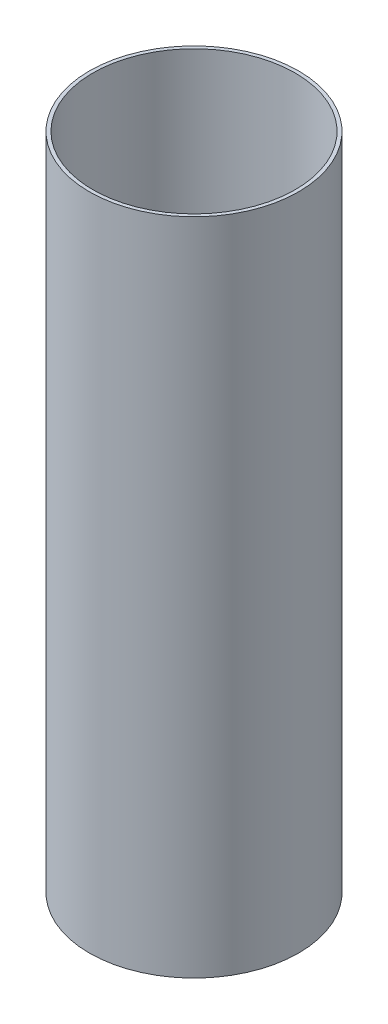
ISO-10303-21;
HEADER;
FILE_DESCRIPTION(('STEP AP214'),'2;1');
FILE_NAME('part.step','',(''),(''),'','','');
FILE_SCHEMA(('AUTOMOTIVE_DESIGN { 1 0 10303 214 1 1 1 1 }'));
ENDSEC;
DATA;
#1=APPLICATION_CONTEXT('core data for automotive mechanical design processes');
#2=APPLICATION_PROTOCOL_DEFINITION('international standard','automotive_design',2000,#1);
#3=PRODUCT_CONTEXT('',#1,'mechanical');
#4=PRODUCT('Part','Part','',(#3));
#5=PRODUCT_RELATED_PRODUCT_CATEGORY('part','',(#4));
#6=PRODUCT_DEFINITION_FORMATION('','',#4);
#7=PRODUCT_DEFINITION_CONTEXT('part definition',#1,'design');
#8=PRODUCT_DEFINITION('design','',#6,#7);
#9=PRODUCT_DEFINITION_SHAPE('','',#8);
#10=(LENGTH_UNIT() NAMED_UNIT(*) SI_UNIT(.MILLI.,.METRE.));
#11=(NAMED_UNIT(*) PLANE_ANGLE_UNIT() SI_UNIT($,.RADIAN.));
#12=(NAMED_UNIT(*) SI_UNIT($,.STERADIAN.) SOLID_ANGLE_UNIT());
#13=UNCERTAINTY_MEASURE_WITH_UNIT(LENGTH_MEASURE(1.E-05),#10,'distance_accuracy_value','');
#14=(GEOMETRIC_REPRESENTATION_CONTEXT(3) GLOBAL_UNCERTAINTY_ASSIGNED_CONTEXT((#13)) GLOBAL_UNIT_ASSIGNED_CONTEXT((#10,
#11,#12)) REPRESENTATION_CONTEXT('',''));
#15=CARTESIAN_POINT('',(0.,0.,0.));
#16=DIRECTION('',(0.,0.,1.));
#17=DIRECTION('',(1.,0.,0.));
#18=AXIS2_PLACEMENT_3D('',#15,#16,#17);
#19=CARTESIAN_POINT('',(92.075,600.,0.));
#20=DIRECTION('',(0.,1.,0.));
#21=DIRECTION('',(0.,0.,1.));
#22=AXIS2_PLACEMENT_3D('',#19,#20,#21);
#23=PLANE('',#22);
#24=CARTESIAN_POINT('',(0.,600.,0.));
#25=DIRECTION('',(0.,-1.,0.));
#26=DIRECTION('',(0.,0.,-1.));
#27=AXIS2_PLACEMENT_3D('',#24,#25,#26);
#28=CIRCLE('',#27,92.075);
#29=CARTESIAN_POINT('',(0.,600.,-92.075));
#30=VERTEX_POINT('',#29);
#31=EDGE_CURVE('E47',#30,#30,#28,.T.);
#32=ORIENTED_EDGE('',*,*,#31,.T.);
#33=EDGE_LOOP('',(#32));
#34=FACE_BOUND('',#33,.T.);
#35=CARTESIAN_POINT('',(0.,600.,0.));
#36=DIRECTION('',(0.,-1.,0.));
#37=DIRECTION('',(0.,0.,-1.));
#38=AXIS2_PLACEMENT_3D('',#35,#36,#37);
#39=CIRCLE('',#38,95.25);
#40=CARTESIAN_POINT('',(0.,600.,-95.25));
#41=VERTEX_POINT('',#40);
#42=EDGE_CURVE('E10',#41,#41,#39,.T.);
#43=ORIENTED_EDGE('',*,*,#42,.F.);
#44=EDGE_LOOP('',(#43));
#45=FACE_BOUND('',#44,.T.);
#46=ADVANCED_FACE('F33',(#34,#45),#23,.T.);
#47=CARTESIAN_POINT('',(0.,0.,0.));
#48=DIRECTION('',(0.,-1.,0.));
#49=DIRECTION('',(0.,0.,-1.));
#50=AXIS2_PLACEMENT_3D('',#47,#48,#49);
#51=CYLINDRICAL_SURFACE('',#50,95.2500000000001);
#52=ORIENTED_EDGE('',*,*,#42,.T.);
#53=EDGE_LOOP('',(#52));
#54=FACE_BOUND('',#53,.T.);
#55=CARTESIAN_POINT('',(0.,0.,0.));
#56=DIRECTION('',(0.,-1.,0.));
#57=DIRECTION('',(0.,0.,-1.));
#58=AXIS2_PLACEMENT_3D('',#55,#56,#57);
#59=CIRCLE('',#58,95.2500000000002);
#60=CARTESIAN_POINT('',(0.,0.,-95.2500000000002));
#61=VERTEX_POINT('',#60);
#62=EDGE_CURVE('E39',#61,#61,#59,.T.);
#63=ORIENTED_EDGE('',*,*,#62,.F.);
#64=EDGE_LOOP('',(#63));
#65=FACE_BOUND('',#64,.T.);
#66=ADVANCED_FACE('F63',(#54,#65),#51,.T.);
#67=CARTESIAN_POINT('',(95.2500000000002,0.,0.));
#68=DIRECTION('',(0.,-1.,0.));
#69=DIRECTION('',(0.,0.,-1.));
#70=AXIS2_PLACEMENT_3D('',#67,#68,#69);
#71=PLANE('',#70);
#72=ORIENTED_EDGE('',*,*,#62,.T.);
#73=EDGE_LOOP('',(#72));
#74=FACE_BOUND('',#73,.T.);
#75=CARTESIAN_POINT('',(0.,0.,0.));
#76=DIRECTION('',(0.,-1.,0.));
#77=DIRECTION('',(0.,0.,-1.));
#78=AXIS2_PLACEMENT_3D('',#75,#76,#77);
#79=CIRCLE('',#78,92.075);
#80=CARTESIAN_POINT('',(0.,0.,-92.075));
#81=VERTEX_POINT('',#80);
#82=EDGE_CURVE('E43',#81,#81,#79,.T.);
#83=ORIENTED_EDGE('',*,*,#82,.F.);
#84=EDGE_LOOP('',(#83));
#85=FACE_BOUND('',#84,.T.);
#86=ADVANCED_FACE('F57',(#74,#85),#71,.T.);
#87=CARTESIAN_POINT('',(0.,0.,0.));
#88=DIRECTION('',(0.,-1.,0.));
#89=DIRECTION('',(0.,0.,-1.));
#90=AXIS2_PLACEMENT_3D('',#87,#88,#89);
#91=CYLINDRICAL_SURFACE('',#90,92.075);
#92=ORIENTED_EDGE('',*,*,#82,.T.);
#93=EDGE_LOOP('',(#92));
#94=FACE_BOUND('',#93,.T.);
#95=ORIENTED_EDGE('',*,*,#31,.F.);
#96=EDGE_LOOP('',(#95));
#97=FACE_BOUND('',#96,.T.);
#98=ADVANCED_FACE('F55',(#94,#97),#91,.F.);
#99=CLOSED_SHELL('',(#46,#66,#86,#98));
#100=MANIFOLD_SOLID_BREP('B2',#99);
#101=ADVANCED_BREP_SHAPE_REPRESENTATION('',(#18,#100),#14);
#102=SHAPE_DEFINITION_REPRESENTATION(#9,#101);
ENDSEC;
END-ISO-10303-21;
